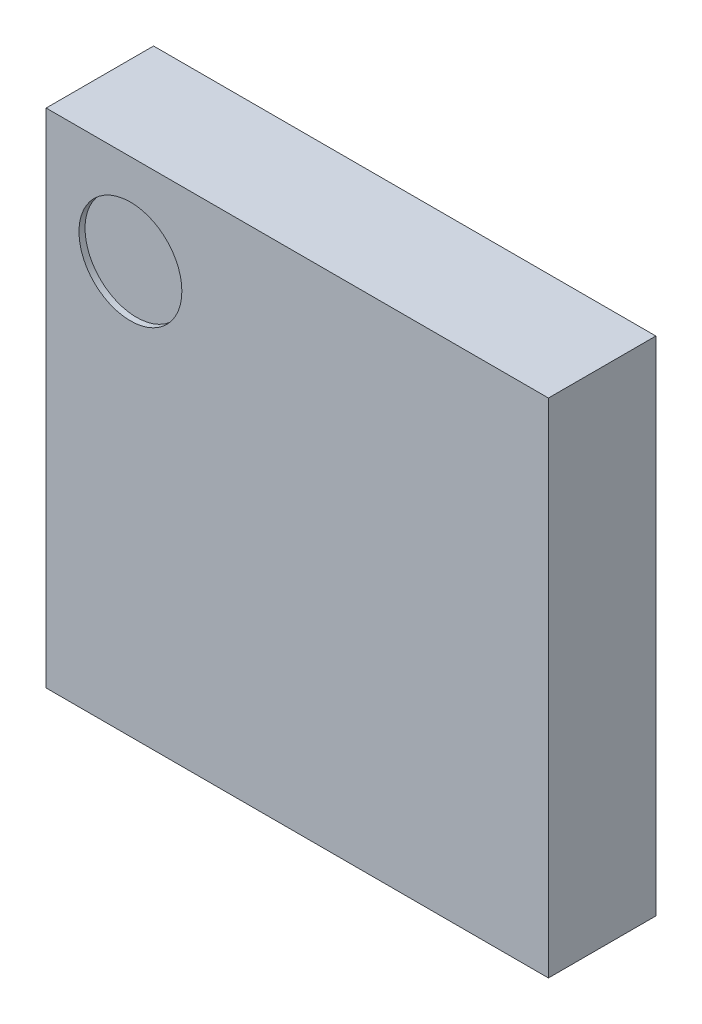
ISO-10303-21;
HEADER;
FILE_DESCRIPTION(('STEP AP214'),'2;1');
FILE_NAME('part.step','',(''),(''),'','','');
FILE_SCHEMA(('AUTOMOTIVE_DESIGN { 1 0 10303 214 1 1 1 1 }'));
ENDSEC;
DATA;
#1=APPLICATION_CONTEXT('core data for automotive mechanical design processes');
#2=APPLICATION_PROTOCOL_DEFINITION('international standard','automotive_design',2000,#1);
#3=PRODUCT_CONTEXT('',#1,'mechanical');
#4=PRODUCT('Part','Part','',(#3));
#5=PRODUCT_RELATED_PRODUCT_CATEGORY('part','',(#4));
#6=PRODUCT_DEFINITION_FORMATION('','',#4);
#7=PRODUCT_DEFINITION_CONTEXT('part definition',#1,'design');
#8=PRODUCT_DEFINITION('design','',#6,#7);
#9=PRODUCT_DEFINITION_SHAPE('','',#8);
#10=(LENGTH_UNIT() NAMED_UNIT(*) SI_UNIT(.MILLI.,.METRE.));
#11=(NAMED_UNIT(*) PLANE_ANGLE_UNIT() SI_UNIT($,.RADIAN.));
#12=(NAMED_UNIT(*) SI_UNIT($,.STERADIAN.) SOLID_ANGLE_UNIT());
#13=UNCERTAINTY_MEASURE_WITH_UNIT(LENGTH_MEASURE(1.E-05),#10,'distance_accuracy_value','');
#14=(GEOMETRIC_REPRESENTATION_CONTEXT(3) GLOBAL_UNCERTAINTY_ASSIGNED_CONTEXT((#13)) GLOBAL_UNIT_ASSIGNED_CONTEXT((#10,
#11,#12)) REPRESENTATION_CONTEXT('',''));
#15=CARTESIAN_POINT('',(0.,0.,0.));
#16=DIRECTION('',(0.,0.,1.));
#17=DIRECTION('',(1.,0.,0.));
#18=AXIS2_PLACEMENT_3D('',#15,#16,#17);
#19=CARTESIAN_POINT('',(0.83,-0.83,0.355));
#20=DIRECTION('',(-1.,0.,0.));
#21=DIRECTION('',(0.,0.,1.));
#22=AXIS2_PLACEMENT_3D('',#19,#20,#21);
#23=PLANE('',#22);
#24=DIRECTION('',(0.,1.,0.));
#25=VECTOR('',#24,1.);
#26=CARTESIAN_POINT('',(0.83,-0.83,0.));
#27=LINE('',#26,#25);
#28=CARTESIAN_POINT('',(0.83,-0.83,0.));
#29=VERTEX_POINT('',#28);
#30=CARTESIAN_POINT('',(0.83,0.83,0.));
#31=VERTEX_POINT('',#30);
#32=EDGE_CURVE('E111',#29,#31,#27,.T.);
#33=ORIENTED_EDGE('',*,*,#32,.T.);
#34=DIRECTION('',(0.,0.,-1.));
#35=VECTOR('',#34,1.);
#36=CARTESIAN_POINT('',(0.83,0.83,0.355));
#37=LINE('',#36,#35);
#38=CARTESIAN_POINT('',(0.83,0.83,0.355));
#39=VERTEX_POINT('',#38);
#40=EDGE_CURVE('E100',#39,#31,#37,.T.);
#41=ORIENTED_EDGE('',*,*,#40,.F.);
#42=DIRECTION('',(0.,1.,0.));
#43=VECTOR('',#42,1.);
#44=CARTESIAN_POINT('',(0.83,-0.83,0.355));
#45=LINE('',#44,#43);
#46=CARTESIAN_POINT('',(0.83,-0.83,0.355));
#47=VERTEX_POINT('',#46);
#48=EDGE_CURVE('E92',#47,#39,#45,.T.);
#49=ORIENTED_EDGE('',*,*,#48,.F.);
#50=DIRECTION('',(0.,0.,-1.));
#51=VECTOR('',#50,1.);
#52=CARTESIAN_POINT('',(0.83,-0.83,0.355));
#53=LINE('',#52,#51);
#54=EDGE_CURVE('E107',#47,#29,#53,.T.);
#55=ORIENTED_EDGE('',*,*,#54,.T.);
#56=EDGE_LOOP('',(#33,#41,#49,#55));
#57=FACE_BOUND('',#56,.T.);
#58=ADVANCED_FACE('F39',(#57),#23,.F.);
#59=CARTESIAN_POINT('',(-0.83,0.83,0.355));
#60=DIRECTION('',(0.,-1.,0.));
#61=DIRECTION('',(0.,0.,-1.));
#62=AXIS2_PLACEMENT_3D('',#59,#60,#61);
#63=PLANE('',#62);
#64=DIRECTION('',(-1.,0.,0.));
#65=VECTOR('',#64,1.);
#66=CARTESIAN_POINT('',(-0.83,0.83,0.));
#67=LINE('',#66,#65);
#68=CARTESIAN_POINT('',(-0.83,0.83,0.));
#69=VERTEX_POINT('',#68);
#70=EDGE_CURVE('E98',#31,#69,#67,.T.);
#71=ORIENTED_EDGE('',*,*,#70,.T.);
#72=DIRECTION('',(0.,0.,-1.));
#73=VECTOR('',#72,1.);
#74=CARTESIAN_POINT('',(-0.83,0.83,0.355));
#75=LINE('',#74,#73);
#76=CARTESIAN_POINT('',(-0.83,0.83,0.355));
#77=VERTEX_POINT('',#76);
#78=EDGE_CURVE('E96',#77,#69,#75,.T.);
#79=ORIENTED_EDGE('',*,*,#78,.F.);
#80=DIRECTION('',(-1.,0.,0.));
#81=VECTOR('',#80,1.);
#82=CARTESIAN_POINT('',(-0.83,0.83,0.355));
#83=LINE('',#82,#81);
#84=EDGE_CURVE('E87',#39,#77,#83,.T.);
#85=ORIENTED_EDGE('',*,*,#84,.F.);
#86=ORIENTED_EDGE('',*,*,#40,.T.);
#87=EDGE_LOOP('',(#71,#79,#85,#86));
#88=FACE_BOUND('',#87,.T.);
#89=ADVANCED_FACE('F97',(#88),#63,.F.);
#90=CARTESIAN_POINT('',(-0.83,-0.83,0.355));
#91=DIRECTION('',(1.,0.,0.));
#92=DIRECTION('',(0.,0.,-1.));
#93=AXIS2_PLACEMENT_3D('',#90,#91,#92);
#94=PLANE('',#93);
#95=DIRECTION('',(0.,-1.,0.));
#96=VECTOR('',#95,1.);
#97=CARTESIAN_POINT('',(-0.83,-0.83,0.));
#98=LINE('',#97,#96);
#99=CARTESIAN_POINT('',(-0.83,-0.83,0.));
#100=VERTEX_POINT('',#99);
#101=EDGE_CURVE('E73',#69,#100,#98,.T.);
#102=ORIENTED_EDGE('',*,*,#101,.T.);
#103=DIRECTION('',(0.,0.,-1.));
#104=VECTOR('',#103,1.);
#105=CARTESIAN_POINT('',(-0.83,-0.83,0.355));
#106=LINE('',#105,#104);
#107=CARTESIAN_POINT('',(-0.83,-0.83,0.355));
#108=VERTEX_POINT('',#107);
#109=EDGE_CURVE('E101',#108,#100,#106,.T.);
#110=ORIENTED_EDGE('',*,*,#109,.F.);
#111=DIRECTION('',(0.,-1.,0.));
#112=VECTOR('',#111,1.);
#113=CARTESIAN_POINT('',(-0.83,-0.83,0.355));
#114=LINE('',#113,#112);
#115=EDGE_CURVE('E90',#77,#108,#114,.T.);
#116=ORIENTED_EDGE('',*,*,#115,.F.);
#117=ORIENTED_EDGE('',*,*,#78,.T.);
#118=EDGE_LOOP('',(#102,#110,#116,#117));
#119=FACE_BOUND('',#118,.T.);
#120=ADVANCED_FACE('F103',(#119),#94,.F.);
#121=CARTESIAN_POINT('',(-0.83,-0.83,0.355));
#122=DIRECTION('',(0.,1.,0.));
#123=DIRECTION('',(0.,0.,1.));
#124=AXIS2_PLACEMENT_3D('',#121,#122,#123);
#125=PLANE('',#124);
#126=DIRECTION('',(1.,0.,0.));
#127=VECTOR('',#126,1.);
#128=CARTESIAN_POINT('',(-0.83,-0.83,0.));
#129=LINE('',#128,#127);
#130=EDGE_CURVE('E79',#100,#29,#129,.T.);
#131=ORIENTED_EDGE('',*,*,#130,.T.);
#132=ORIENTED_EDGE('',*,*,#54,.F.);
#133=DIRECTION('',(1.,0.,0.));
#134=VECTOR('',#133,1.);
#135=CARTESIAN_POINT('',(-0.83,-0.83,0.355));
#136=LINE('',#135,#134);
#137=EDGE_CURVE('E56',#108,#47,#136,.T.);
#138=ORIENTED_EDGE('',*,*,#137,.F.);
#139=ORIENTED_EDGE('',*,*,#109,.T.);
#140=EDGE_LOOP('',(#131,#132,#138,#139));
#141=FACE_BOUND('',#140,.T.);
#142=ADVANCED_FACE('F183',(#141),#125,.F.);
#143=CARTESIAN_POINT('',(0.,0.,0.355));
#144=DIRECTION('',(0.,0.,-1.));
#145=DIRECTION('',(-1.,0.,0.));
#146=AXIS2_PLACEMENT_3D('',#143,#144,#145);
#147=PLANE('',#146);
#148=CARTESIAN_POINT('',(-0.55149732448001,0.530141066169776,0.355));
#149=DIRECTION('',(0.,0.,1.));
#150=DIRECTION('',(1.,0.,0.));
#151=AXIS2_PLACEMENT_3D('',#148,#149,#150);
#152=CIRCLE('',#151,0.17001175531755);
#153=CARTESIAN_POINT('',(-0.38148556916246,0.530141066169776,0.355));
#154=VERTEX_POINT('',#153);
#155=EDGE_CURVE('E333',#154,#154,#152,.T.);
#156=ORIENTED_EDGE('',*,*,#155,.F.);
#157=EDGE_LOOP('',(#156));
#158=FACE_BOUND('',#157,.T.);
#159=ORIENTED_EDGE('',*,*,#48,.T.);
#160=ORIENTED_EDGE('',*,*,#84,.T.);
#161=ORIENTED_EDGE('',*,*,#115,.T.);
#162=ORIENTED_EDGE('',*,*,#137,.T.);
#163=EDGE_LOOP('',(#159,#160,#161,#162));
#164=FACE_BOUND('',#163,.T.);
#165=ADVANCED_FACE('F88',(#158,#164),#147,.F.);
#166=CARTESIAN_POINT('',(0.,0.,0.));
#167=DIRECTION('',(0.,0.,-1.));
#168=DIRECTION('',(-1.,0.,0.));
#169=AXIS2_PLACEMENT_3D('',#166,#167,#168);
#170=PLANE('',#169);
#171=CARTESIAN_POINT('',(-0.5,0.5,0.));
#172=DIRECTION('',(0.,0.,-1.));
#173=DIRECTION('',(-1.,0.,0.));
#174=AXIS2_PLACEMENT_3D('',#171,#172,#173);
#175=CIRCLE('',#174,0.1113552872566);
#176=CARTESIAN_POINT('',(-0.6113552872566,0.5,0.));
#177=VERTEX_POINT('',#176);
#178=EDGE_CURVE('E11',#177,#177,#175,.T.);
#179=ORIENTED_EDGE('',*,*,#178,.F.);
#180=EDGE_LOOP('',(#179));
#181=FACE_BOUND('',#180,.T.);
#182=CARTESIAN_POINT('',(-0.5,-0.5,0.));
#183=DIRECTION('',(0.,0.,-1.));
#184=DIRECTION('',(-1.,0.,0.));
#185=AXIS2_PLACEMENT_3D('',#182,#183,#184);
#186=CIRCLE('',#185,0.1113552872566);
#187=CARTESIAN_POINT('',(-0.6113552872566,-0.5,0.));
#188=VERTEX_POINT('',#187);
#189=EDGE_CURVE('E48',#188,#188,#186,.T.);
#190=ORIENTED_EDGE('',*,*,#189,.F.);
#191=EDGE_LOOP('',(#190));
#192=FACE_BOUND('',#191,.T.);
#193=CARTESIAN_POINT('',(-0.5,0.,0.));
#194=DIRECTION('',(0.,0.,-1.));
#195=DIRECTION('',(-1.,0.,0.));
#196=AXIS2_PLACEMENT_3D('',#193,#194,#195);
#197=CIRCLE('',#196,0.1113552872566);
#198=CARTESIAN_POINT('',(-0.6113552872566,0.,0.));
#199=VERTEX_POINT('',#198);
#200=EDGE_CURVE('E152',#199,#199,#197,.T.);
#201=ORIENTED_EDGE('',*,*,#200,.F.);
#202=EDGE_LOOP('',(#201));
#203=FACE_BOUND('',#202,.T.);
#204=CARTESIAN_POINT('',(0.5,0.5,0.));
#205=DIRECTION('',(0.,0.,-1.));
#206=DIRECTION('',(-1.,0.,0.));
#207=AXIS2_PLACEMENT_3D('',#204,#205,#206);
#208=CIRCLE('',#207,0.1113552872566);
#209=CARTESIAN_POINT('',(0.3886447127434,0.5,0.));
#210=VERTEX_POINT('',#209);
#211=EDGE_CURVE('E148',#210,#210,#208,.T.);
#212=ORIENTED_EDGE('',*,*,#211,.F.);
#213=EDGE_LOOP('',(#212));
#214=FACE_BOUND('',#213,.T.);
#215=CARTESIAN_POINT('',(0.5,-0.5,0.));
#216=DIRECTION('',(0.,0.,-1.));
#217=DIRECTION('',(-1.,0.,0.));
#218=AXIS2_PLACEMENT_3D('',#215,#216,#217);
#219=CIRCLE('',#218,0.1113552872566);
#220=CARTESIAN_POINT('',(0.3886447127434,-0.5,0.));
#221=VERTEX_POINT('',#220);
#222=EDGE_CURVE('E144',#221,#221,#219,.T.);
#223=ORIENTED_EDGE('',*,*,#222,.F.);
#224=EDGE_LOOP('',(#223));
#225=FACE_BOUND('',#224,.T.);
#226=CARTESIAN_POINT('',(0.5,0.,0.));
#227=DIRECTION('',(0.,0.,-1.));
#228=DIRECTION('',(-1.,0.,0.));
#229=AXIS2_PLACEMENT_3D('',#226,#227,#228);
#230=CIRCLE('',#229,0.1113552872566);
#231=CARTESIAN_POINT('',(0.3886447127434,0.,0.));
#232=VERTEX_POINT('',#231);
#233=EDGE_CURVE('E140',#232,#232,#230,.T.);
#234=ORIENTED_EDGE('',*,*,#233,.F.);
#235=EDGE_LOOP('',(#234));
#236=FACE_BOUND('',#235,.T.);
#237=CARTESIAN_POINT('',(0.,0.5,0.));
#238=DIRECTION('',(0.,0.,-1.));
#239=DIRECTION('',(-1.,0.,0.));
#240=AXIS2_PLACEMENT_3D('',#237,#238,#239);
#241=CIRCLE('',#240,0.1113552872566);
#242=CARTESIAN_POINT('',(-0.1113552872566,0.5,0.));
#243=VERTEX_POINT('',#242);
#244=EDGE_CURVE('E136',#243,#243,#241,.T.);
#245=ORIENTED_EDGE('',*,*,#244,.F.);
#246=EDGE_LOOP('',(#245));
#247=FACE_BOUND('',#246,.T.);
#248=CARTESIAN_POINT('',(0.,-0.5,0.));
#249=DIRECTION('',(0.,0.,-1.));
#250=DIRECTION('',(-1.,0.,0.));
#251=AXIS2_PLACEMENT_3D('',#248,#249,#250);
#252=CIRCLE('',#251,0.1113552872566);
#253=CARTESIAN_POINT('',(-0.1113552872566,-0.5,0.));
#254=VERTEX_POINT('',#253);
#255=EDGE_CURVE('E132',#254,#254,#252,.T.);
#256=ORIENTED_EDGE('',*,*,#255,.F.);
#257=EDGE_LOOP('',(#256));
#258=FACE_BOUND('',#257,.T.);
#259=CARTESIAN_POINT('',(0.,0.,0.));
#260=DIRECTION('',(0.,0.,-1.));
#261=DIRECTION('',(-1.,0.,0.));
#262=AXIS2_PLACEMENT_3D('',#259,#260,#261);
#263=CIRCLE('',#262,0.1113552872566);
#264=CARTESIAN_POINT('',(-0.1113552872566,0.,0.));
#265=VERTEX_POINT('',#264);
#266=EDGE_CURVE('E128',#265,#265,#263,.T.);
#267=ORIENTED_EDGE('',*,*,#266,.F.);
#268=EDGE_LOOP('',(#267));
#269=FACE_BOUND('',#268,.T.);
#270=ORIENTED_EDGE('',*,*,#32,.F.);
#271=ORIENTED_EDGE('',*,*,#130,.F.);
#272=ORIENTED_EDGE('',*,*,#101,.F.);
#273=ORIENTED_EDGE('',*,*,#70,.F.);
#274=EDGE_LOOP('',(#270,#271,#272,#273));
#275=FACE_BOUND('',#274,.T.);
#276=ADVANCED_FACE('F161',(#181,#192,#203,#214,#225,#236,#247,#258,#269,#275),#170,.T.);
#277=CARTESIAN_POINT('',(0.,0.,-0.069));
#278=DIRECTION('',(0.,0.,1.));
#279=DIRECTION('',(1.,0.,0.));
#280=AXIS2_PLACEMENT_3D('',#277,#278,#279);
#281=SPHERICAL_SURFACE('',#280,0.131);
#282=ORIENTED_EDGE('',*,*,#266,.T.);
#283=EDGE_LOOP('',(#282));
#284=FACE_BOUND('',#283,.T.);
#285=ADVANCED_FACE('F164',(#284),#281,.T.);
#286=CARTESIAN_POINT('',(0.,-0.5,-0.069));
#287=DIRECTION('',(0.,0.,1.));
#288=DIRECTION('',(1.,0.,0.));
#289=AXIS2_PLACEMENT_3D('',#286,#287,#288);
#290=SPHERICAL_SURFACE('',#289,0.131);
#291=ORIENTED_EDGE('',*,*,#255,.T.);
#292=EDGE_LOOP('',(#291));
#293=FACE_BOUND('',#292,.T.);
#294=ADVANCED_FACE('F217',(#293),#290,.T.);
#295=CARTESIAN_POINT('',(0.,0.5,-0.069));
#296=DIRECTION('',(0.,0.,1.));
#297=DIRECTION('',(1.,0.,0.));
#298=AXIS2_PLACEMENT_3D('',#295,#296,#297);
#299=SPHERICAL_SURFACE('',#298,0.131);
#300=ORIENTED_EDGE('',*,*,#244,.T.);
#301=EDGE_LOOP('',(#300));
#302=FACE_BOUND('',#301,.T.);
#303=ADVANCED_FACE('F228',(#302),#299,.T.);
#304=CARTESIAN_POINT('',(0.5,0.,-0.069));
#305=DIRECTION('',(0.,0.,1.));
#306=DIRECTION('',(1.,0.,0.));
#307=AXIS2_PLACEMENT_3D('',#304,#305,#306);
#308=SPHERICAL_SURFACE('',#307,0.131);
#309=ORIENTED_EDGE('',*,*,#233,.T.);
#310=EDGE_LOOP('',(#309));
#311=FACE_BOUND('',#310,.T.);
#312=ADVANCED_FACE('F238',(#311),#308,.T.);
#313=CARTESIAN_POINT('',(0.5,-0.5,-0.069));
#314=DIRECTION('',(0.,0.,1.));
#315=DIRECTION('',(1.,0.,0.));
#316=AXIS2_PLACEMENT_3D('',#313,#314,#315);
#317=SPHERICAL_SURFACE('',#316,0.131);
#318=ORIENTED_EDGE('',*,*,#222,.T.);
#319=EDGE_LOOP('',(#318));
#320=FACE_BOUND('',#319,.T.);
#321=ADVANCED_FACE('F248',(#320),#317,.T.);
#322=CARTESIAN_POINT('',(0.5,0.5,-0.069));
#323=DIRECTION('',(0.,0.,1.));
#324=DIRECTION('',(1.,0.,0.));
#325=AXIS2_PLACEMENT_3D('',#322,#323,#324);
#326=SPHERICAL_SURFACE('',#325,0.131);
#327=ORIENTED_EDGE('',*,*,#211,.T.);
#328=EDGE_LOOP('',(#327));
#329=FACE_BOUND('',#328,.T.);
#330=ADVANCED_FACE('F258',(#329),#326,.T.);
#331=CARTESIAN_POINT('',(-0.5,0.,-0.069));
#332=DIRECTION('',(0.,0.,1.));
#333=DIRECTION('',(1.,0.,0.));
#334=AXIS2_PLACEMENT_3D('',#331,#332,#333);
#335=SPHERICAL_SURFACE('',#334,0.131);
#336=ORIENTED_EDGE('',*,*,#200,.T.);
#337=EDGE_LOOP('',(#336));
#338=FACE_BOUND('',#337,.T.);
#339=ADVANCED_FACE('F268',(#338),#335,.T.);
#340=CARTESIAN_POINT('',(-0.5,-0.5,-0.069));
#341=DIRECTION('',(0.,0.,1.));
#342=DIRECTION('',(1.,0.,0.));
#343=AXIS2_PLACEMENT_3D('',#340,#341,#342);
#344=SPHERICAL_SURFACE('',#343,0.131);
#345=ORIENTED_EDGE('',*,*,#189,.T.);
#346=EDGE_LOOP('',(#345));
#347=FACE_BOUND('',#346,.T.);
#348=ADVANCED_FACE('F159',(#347),#344,.T.);
#349=CARTESIAN_POINT('',(-0.5,0.5,-0.069));
#350=DIRECTION('',(0.,0.,1.));
#351=DIRECTION('',(1.,0.,0.));
#352=AXIS2_PLACEMENT_3D('',#349,#350,#351);
#353=SPHERICAL_SURFACE('',#352,0.131);
#354=ORIENTED_EDGE('',*,*,#178,.T.);
#355=EDGE_LOOP('',(#354));
#356=FACE_BOUND('',#355,.T.);
#357=ADVANCED_FACE('F292',(#356),#353,.T.);
#358=CARTESIAN_POINT('',(-0.55149732448001,0.530141066169776,0.335));
#359=DIRECTION('',(0.,0.,1.));
#360=DIRECTION('',(1.,0.,0.));
#361=AXIS2_PLACEMENT_3D('',#358,#359,#360);
#362=CYLINDRICAL_SURFACE('',#361,0.17001175531755);
#363=CARTESIAN_POINT('',(-0.55149732448001,0.530141066169776,0.335));
#364=DIRECTION('',(0.,0.,1.));
#365=DIRECTION('',(1.,0.,0.));
#366=AXIS2_PLACEMENT_3D('',#363,#364,#365);
#367=CIRCLE('',#366,0.17001175531755);
#368=CARTESIAN_POINT('',(-0.38148556916246,0.530141066169776,0.335));
#369=VERTEX_POINT('',#368);
#370=EDGE_CURVE('E115',#369,#369,#367,.T.);
#371=ORIENTED_EDGE('',*,*,#370,.F.);
#372=EDGE_LOOP('',(#371));
#373=FACE_BOUND('',#372,.T.);
#374=ORIENTED_EDGE('',*,*,#155,.T.);
#375=EDGE_LOOP('',(#374));
#376=FACE_BOUND('',#375,.T.);
#377=ADVANCED_FACE('F301',(#373,#376),#362,.F.);
#378=CARTESIAN_POINT('',(-0.55149732448001,0.530141066169776,0.335));
#379=DIRECTION('',(0.,0.,1.));
#380=DIRECTION('',(1.,0.,0.));
#381=AXIS2_PLACEMENT_3D('',#378,#379,#380);
#382=PLANE('',#381);
#383=ORIENTED_EDGE('',*,*,#370,.T.);
#384=EDGE_LOOP('',(#383));
#385=FACE_BOUND('',#384,.T.);
#386=ADVANCED_FACE('F316',(#385),#382,.T.);
#387=CLOSED_SHELL('',(#58,#89,#120,#142,#165,#276,#285,#294,#303,#312,#321,#330,#339,#348,#357,
#377,#386));
#388=MANIFOLD_SOLID_BREP('B2',#387);
#389=ADVANCED_BREP_SHAPE_REPRESENTATION('',(#18,#388),#14);
#390=SHAPE_DEFINITION_REPRESENTATION(#9,#389);
ENDSEC;
END-ISO-10303-21;
